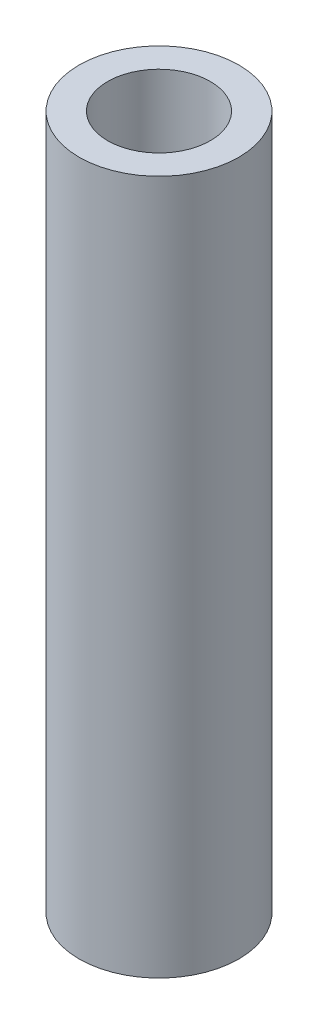
ISO-10303-21;
HEADER;
FILE_DESCRIPTION(('STEP AP214'),'2;1');
FILE_NAME('part.step','',(''),(''),'','','');
FILE_SCHEMA(('AUTOMOTIVE_DESIGN { 1 0 10303 214 1 1 1 1 }'));
ENDSEC;
DATA;
#1=APPLICATION_CONTEXT('core data for automotive mechanical design processes');
#2=APPLICATION_PROTOCOL_DEFINITION('international standard','automotive_design',2000,#1);
#3=PRODUCT_CONTEXT('',#1,'mechanical');
#4=PRODUCT('Part','Part','',(#3));
#5=PRODUCT_RELATED_PRODUCT_CATEGORY('part','',(#4));
#6=PRODUCT_DEFINITION_FORMATION('','',#4);
#7=PRODUCT_DEFINITION_CONTEXT('part definition',#1,'design');
#8=PRODUCT_DEFINITION('design','',#6,#7);
#9=PRODUCT_DEFINITION_SHAPE('','',#8);
#10=(LENGTH_UNIT() NAMED_UNIT(*) SI_UNIT(.MILLI.,.METRE.));
#11=(NAMED_UNIT(*) PLANE_ANGLE_UNIT() SI_UNIT($,.RADIAN.));
#12=(NAMED_UNIT(*) SI_UNIT($,.STERADIAN.) SOLID_ANGLE_UNIT());
#13=UNCERTAINTY_MEASURE_WITH_UNIT(LENGTH_MEASURE(1.E-05),#10,'distance_accuracy_value','');
#14=(GEOMETRIC_REPRESENTATION_CONTEXT(3) GLOBAL_UNCERTAINTY_ASSIGNED_CONTEXT((#13)) GLOBAL_UNIT_ASSIGNED_CONTEXT((#10,
#11,#12)) REPRESENTATION_CONTEXT('',''));
#15=CARTESIAN_POINT('',(0.,0.,0.));
#16=DIRECTION('',(0.,0.,1.));
#17=DIRECTION('',(1.,0.,0.));
#18=AXIS2_PLACEMENT_3D('',#15,#16,#17);
#19=CARTESIAN_POINT('',(0.,33.669986,0.));
#20=DIRECTION('',(0.,1.,0.));
#21=DIRECTION('',(0.,0.,1.));
#22=AXIS2_PLACEMENT_3D('',#19,#20,#21);
#23=PLANE('',#22);
#24=CARTESIAN_POINT('',(0.,33.669986,0.));
#25=DIRECTION('',(0.,1.,0.));
#26=DIRECTION('',(0.,0.,1.));
#27=AXIS2_PLACEMENT_3D('',#24,#25,#26);
#28=CIRCLE('',#27,3.873);
#29=CARTESIAN_POINT('',(0.,33.669986,3.873));
#30=VERTEX_POINT('',#29);
#31=EDGE_CURVE('E10',#30,#30,#28,.T.);
#32=ORIENTED_EDGE('',*,*,#31,.T.);
#33=EDGE_LOOP('',(#32));
#34=FACE_BOUND('',#33,.T.);
#35=CARTESIAN_POINT('',(0.,33.669986,0.));
#36=DIRECTION('',(0.,1.,0.));
#37=DIRECTION('',(0.,0.,1.));
#38=AXIS2_PLACEMENT_3D('',#35,#36,#37);
#39=CIRCLE('',#38,2.4892);
#40=CARTESIAN_POINT('',(0.,33.669986,2.4892));
#41=VERTEX_POINT('',#40);
#42=EDGE_CURVE('E52',#41,#41,#39,.T.);
#43=ORIENTED_EDGE('',*,*,#42,.F.);
#44=EDGE_LOOP('',(#43));
#45=FACE_BOUND('',#44,.T.);
#46=ADVANCED_FACE('F41',(#34,#45),#23,.T.);
#47=CARTESIAN_POINT('',(0.,0.,0.));
#48=DIRECTION('',(0.,1.,0.));
#49=DIRECTION('',(0.,0.,1.));
#50=AXIS2_PLACEMENT_3D('',#47,#48,#49);
#51=PLANE('',#50);
#52=CARTESIAN_POINT('',(0.,0.,0.));
#53=DIRECTION('',(0.,1.,0.));
#54=DIRECTION('',(0.,0.,1.));
#55=AXIS2_PLACEMENT_3D('',#52,#53,#54);
#56=CIRCLE('',#55,3.873);
#57=CARTESIAN_POINT('',(0.,0.,3.873));
#58=VERTEX_POINT('',#57);
#59=EDGE_CURVE('E45',#58,#58,#56,.T.);
#60=ORIENTED_EDGE('',*,*,#59,.F.);
#61=EDGE_LOOP('',(#60));
#62=FACE_BOUND('',#61,.T.);
#63=CARTESIAN_POINT('',(0.,0.,0.));
#64=DIRECTION('',(0.,1.,0.));
#65=DIRECTION('',(0.,0.,1.));
#66=AXIS2_PLACEMENT_3D('',#63,#64,#65);
#67=CIRCLE('',#66,2.4892);
#68=CARTESIAN_POINT('',(0.,0.,2.4892));
#69=VERTEX_POINT('',#68);
#70=EDGE_CURVE('E54',#69,#69,#67,.T.);
#71=ORIENTED_EDGE('',*,*,#70,.T.);
#72=EDGE_LOOP('',(#71));
#73=FACE_BOUND('',#72,.T.);
#74=ADVANCED_FACE('F64',(#62,#73),#51,.F.);
#75=CARTESIAN_POINT('',(0.,33.669986,0.));
#76=DIRECTION('',(0.,-1.,0.));
#77=DIRECTION('',(0.,0.,-1.));
#78=AXIS2_PLACEMENT_3D('',#75,#76,#77);
#79=CYLINDRICAL_SURFACE('',#78,3.873);
#80=ORIENTED_EDGE('',*,*,#31,.F.);
#81=EDGE_LOOP('',(#80));
#82=FACE_BOUND('',#81,.T.);
#83=ORIENTED_EDGE('',*,*,#59,.T.);
#84=EDGE_LOOP('',(#83));
#85=FACE_BOUND('',#84,.T.);
#86=ADVANCED_FACE('F43',(#82,#85),#79,.T.);
#87=CARTESIAN_POINT('',(0.,33.669986,0.));
#88=DIRECTION('',(0.,-1.,0.));
#89=DIRECTION('',(0.,0.,-1.));
#90=AXIS2_PLACEMENT_3D('',#87,#88,#89);
#91=CYLINDRICAL_SURFACE('',#90,2.4892);
#92=ORIENTED_EDGE('',*,*,#42,.T.);
#93=EDGE_LOOP('',(#92));
#94=FACE_BOUND('',#93,.T.);
#95=ORIENTED_EDGE('',*,*,#70,.F.);
#96=EDGE_LOOP('',(#95));
#97=FACE_BOUND('',#96,.T.);
#98=ADVANCED_FACE('F60',(#94,#97),#91,.F.);
#99=CLOSED_SHELL('',(#46,#74,#86,#98));
#100=MANIFOLD_SOLID_BREP('B2',#99);
#101=ADVANCED_BREP_SHAPE_REPRESENTATION('',(#18,#100),#14);
#102=SHAPE_DEFINITION_REPRESENTATION(#9,#101);
ENDSEC;
END-ISO-10303-21;
